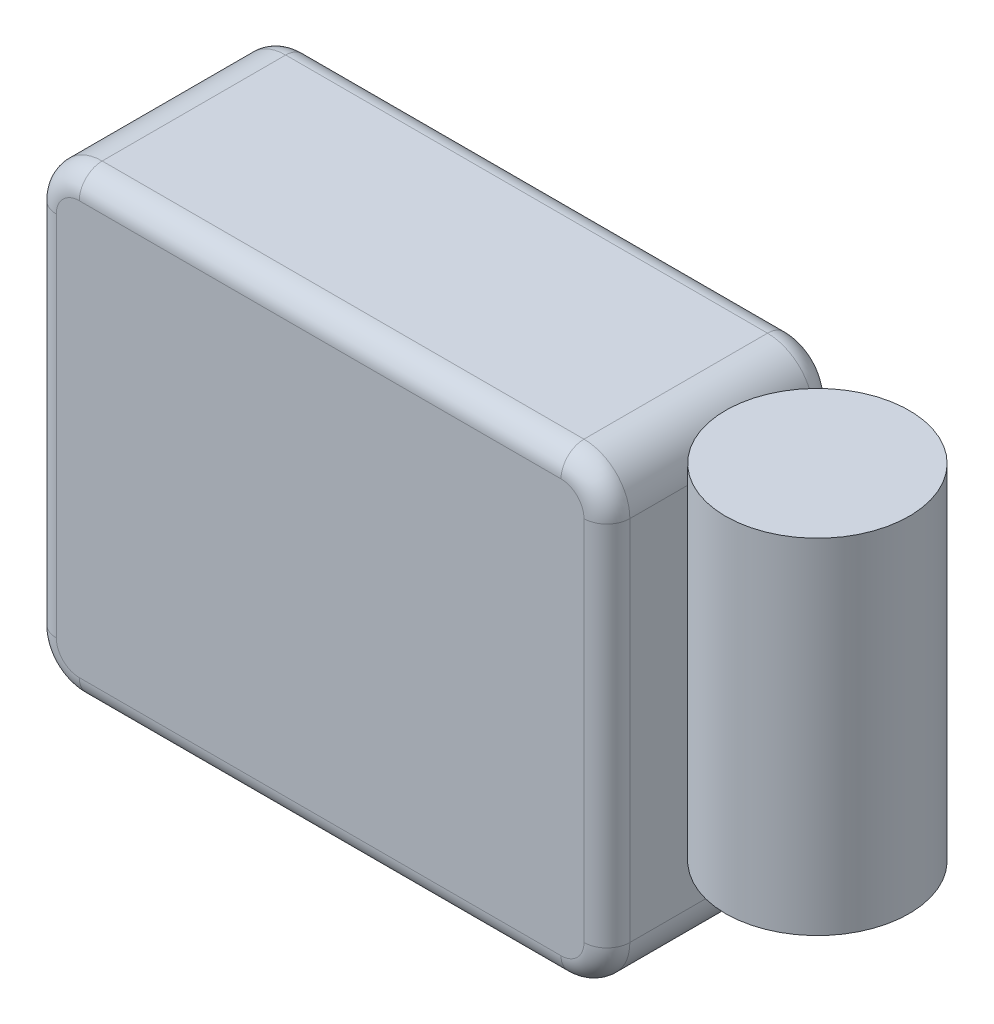
ISO-10303-21;
HEADER;
FILE_DESCRIPTION(('STEP AP214'),'2;1');
FILE_NAME('part.step','',(''),(''),'','','');
FILE_SCHEMA(('AUTOMOTIVE_DESIGN { 1 0 10303 214 1 1 1 1 }'));
ENDSEC;
DATA;
#1=APPLICATION_CONTEXT('core data for automotive mechanical design processes');
#2=APPLICATION_PROTOCOL_DEFINITION('international standard','automotive_design',2000,#1);
#3=PRODUCT_CONTEXT('',#1,'mechanical');
#4=PRODUCT('Part','Part','',(#3));
#5=PRODUCT_RELATED_PRODUCT_CATEGORY('part','',(#4));
#6=PRODUCT_DEFINITION_FORMATION('','',#4);
#7=PRODUCT_DEFINITION_CONTEXT('part definition',#1,'design');
#8=PRODUCT_DEFINITION('design','',#6,#7);
#9=PRODUCT_DEFINITION_SHAPE('','',#8);
#10=(LENGTH_UNIT() NAMED_UNIT(*) SI_UNIT(.MILLI.,.METRE.));
#11=(NAMED_UNIT(*) PLANE_ANGLE_UNIT() SI_UNIT($,.RADIAN.));
#12=(NAMED_UNIT(*) SI_UNIT($,.STERADIAN.) SOLID_ANGLE_UNIT());
#13=UNCERTAINTY_MEASURE_WITH_UNIT(LENGTH_MEASURE(1.E-05),#10,'distance_accuracy_value','');
#14=(GEOMETRIC_REPRESENTATION_CONTEXT(3) GLOBAL_UNCERTAINTY_ASSIGNED_CONTEXT((#13)) GLOBAL_UNIT_ASSIGNED_CONTEXT((#10,
#11,#12)) REPRESENTATION_CONTEXT('',''));
#15=CARTESIAN_POINT('',(0.,0.,0.));
#16=DIRECTION('',(0.,0.,1.));
#17=DIRECTION('',(1.,0.,0.));
#18=AXIS2_PLACEMENT_3D('',#15,#16,#17);
#19=CARTESIAN_POINT('',(155.148869638961,8.05710113009715,4.82615975000589));
#20=DIRECTION('',(0.,1.,0.));
#21=DIRECTION('',(0.,0.,1.));
#22=AXIS2_PLACEMENT_3D('',#19,#20,#21);
#23=CYLINDRICAL_SURFACE('',#22,3.99999999999999);
#24=CARTESIAN_POINT('',(155.148869638961,8.05710113009715,4.82615975000589));
#25=DIRECTION('',(0.,1.,0.));
#26=DIRECTION('',(0.,0.,1.));
#27=AXIS2_PLACEMENT_3D('',#24,#25,#26);
#28=CIRCLE('',#27,3.99999999999999);
#29=CARTESIAN_POINT('',(155.148869638961,8.05710113009715,8.82615975000588));
#30=VERTEX_POINT('',#29);
#31=EDGE_CURVE('E11',#30,#30,#28,.T.);
#32=ORIENTED_EDGE('',*,*,#31,.T.);
#33=EDGE_LOOP('',(#32));
#34=FACE_BOUND('',#33,.T.);
#35=CARTESIAN_POINT('',(155.148869638961,23.0571011300972,4.82615975000589));
#36=DIRECTION('',(0.,1.,0.));
#37=DIRECTION('',(0.,0.,1.));
#38=AXIS2_PLACEMENT_3D('',#35,#36,#37);
#39=CIRCLE('',#38,3.99999999999999);
#40=CARTESIAN_POINT('',(155.148869638961,23.0571011300972,8.82615975000588));
#41=VERTEX_POINT('',#40);
#42=EDGE_CURVE('E46',#41,#41,#39,.T.);
#43=ORIENTED_EDGE('',*,*,#42,.F.);
#44=EDGE_LOOP('',(#43));
#45=FACE_BOUND('',#44,.T.);
#46=ADVANCED_FACE('F43',(#34,#45),#23,.T.);
#47=CARTESIAN_POINT('',(155.148869638961,8.05710113009715,4.82615975000589));
#48=DIRECTION('',(0.,1.,0.));
#49=DIRECTION('',(0.,0.,1.));
#50=AXIS2_PLACEMENT_3D('',#47,#48,#49);
#51=PLANE('',#50);
#52=ORIENTED_EDGE('',*,*,#31,.F.);
#53=EDGE_LOOP('',(#52));
#54=FACE_BOUND('',#53,.T.);
#55=ADVANCED_FACE('F58',(#54),#51,.F.);
#56=CARTESIAN_POINT('',(155.148869638961,23.0571011300972,4.82615975000589));
#57=DIRECTION('',(0.,1.,0.));
#58=DIRECTION('',(0.,0.,1.));
#59=AXIS2_PLACEMENT_3D('',#56,#57,#58);
#60=PLANE('',#59);
#61=ORIENTED_EDGE('',*,*,#42,.T.);
#62=EDGE_LOOP('',(#61));
#63=FACE_BOUND('',#62,.T.);
#64=ADVANCED_FACE('F55',(#63),#60,.T.);
#65=CLOSED_SHELL('',(#46,#55,#64));
#66=MANIFOLD_SOLID_BREP('B2',#65);
#67=CARTESIAN_POINT('',(126.148869638961,23.0571011300972,10.));
#68=DIRECTION('',(1.,0.,0.));
#69=DIRECTION('',(0.,0.,-1.));
#70=AXIS2_PLACEMENT_3D('',#67,#68,#69);
#71=PLANE('',#70);
#72=DIRECTION('',(0.,0.,-1.));
#73=VECTOR('',#72,1.);
#74=CARTESIAN_POINT('',(126.148869638961,21.0571011300971,10.));
#75=LINE('',#74,#73);
#76=CARTESIAN_POINT('',(126.148869638961,21.0571011300971,9.));
#77=VERTEX_POINT('',#76);
#78=CARTESIAN_POINT('',(126.148869638961,21.0571011300971,0.999999999999999));
#79=VERTEX_POINT('',#78);
#80=EDGE_CURVE('E331',#77,#79,#75,.T.);
#81=ORIENTED_EDGE('',*,*,#80,.T.);
#82=DIRECTION('',(0.,-1.,0.));
#83=VECTOR('',#82,1.);
#84=CARTESIAN_POINT('',(126.148869638961,23.0571011300972,0.999999999999999));
#85=LINE('',#84,#83);
#86=CARTESIAN_POINT('',(126.148869638961,5.05710113009715,0.999999999999999));
#87=VERTEX_POINT('',#86);
#88=EDGE_CURVE('E258',#79,#87,#85,.T.);
#89=ORIENTED_EDGE('',*,*,#88,.T.);
#90=DIRECTION('',(0.,0.,-1.));
#91=VECTOR('',#90,1.);
#92=CARTESIAN_POINT('',(126.148869638961,5.05710113009715,10.));
#93=LINE('',#92,#91);
#94=CARTESIAN_POINT('',(126.148869638961,5.05710113009715,9.));
#95=VERTEX_POINT('',#94);
#96=EDGE_CURVE('E289',#87,#95,#93,.F.);
#97=ORIENTED_EDGE('',*,*,#96,.T.);
#98=DIRECTION('',(0.,-1.,0.));
#99=VECTOR('',#98,1.);
#100=CARTESIAN_POINT('',(126.148869638961,21.0571011300971,9.));
#101=LINE('',#100,#99);
#102=EDGE_CURVE('E256',#95,#77,#101,.F.);
#103=ORIENTED_EDGE('',*,*,#102,.T.);
#104=EDGE_LOOP('',(#81,#89,#97,#103));
#105=FACE_BOUND('',#104,.T.);
#106=ADVANCED_FACE('F84',(#105),#71,.F.);
#107=CARTESIAN_POINT('',(126.148869638961,3.05710113009715,10.));
#108=DIRECTION('',(0.,1.,0.));
#109=DIRECTION('',(0.,0.,1.));
#110=AXIS2_PLACEMENT_3D('',#107,#108,#109);
#111=PLANE('',#110);
#112=DIRECTION('',(0.,0.,-1.));
#113=VECTOR('',#112,1.);
#114=CARTESIAN_POINT('',(128.148869638961,3.05710113009715,10.));
#115=LINE('',#114,#113);
#116=CARTESIAN_POINT('',(128.148869638961,3.05710113009715,9.));
#117=VERTEX_POINT('',#116);
#118=CARTESIAN_POINT('',(128.148869638961,3.05710113009715,0.999999999999999));
#119=VERTEX_POINT('',#118);
#120=EDGE_CURVE('E327',#117,#119,#115,.T.);
#121=ORIENTED_EDGE('',*,*,#120,.T.);
#122=DIRECTION('',(1.,0.,0.));
#123=VECTOR('',#122,1.);
#124=CARTESIAN_POINT('',(126.148869638961,3.05710113009715,0.999999999999999));
#125=LINE('',#124,#123);
#126=CARTESIAN_POINT('',(149.148869638961,3.05710113009715,0.999999999999999));
#127=VERTEX_POINT('',#126);
#128=EDGE_CURVE('E233',#119,#127,#125,.T.);
#129=ORIENTED_EDGE('',*,*,#128,.T.);
#130=DIRECTION('',(0.,0.,-1.));
#131=VECTOR('',#130,1.);
#132=CARTESIAN_POINT('',(149.148869638961,3.05710113009715,10.));
#133=LINE('',#132,#131);
#134=CARTESIAN_POINT('',(149.148869638961,3.05710113009715,9.));
#135=VERTEX_POINT('',#134);
#136=EDGE_CURVE('E217',#127,#135,#133,.F.);
#137=ORIENTED_EDGE('',*,*,#136,.T.);
#138=DIRECTION('',(1.,0.,0.));
#139=VECTOR('',#138,1.);
#140=CARTESIAN_POINT('',(128.148869638961,3.05710113009715,9.));
#141=LINE('',#140,#139);
#142=EDGE_CURVE('E231',#135,#117,#141,.F.);
#143=ORIENTED_EDGE('',*,*,#142,.T.);
#144=EDGE_LOOP('',(#121,#129,#137,#143));
#145=FACE_BOUND('',#144,.T.);
#146=ADVANCED_FACE('F368',(#145),#111,.F.);
#147=CARTESIAN_POINT('',(151.148869638961,23.0571011300972,10.));
#148=DIRECTION('',(-1.,0.,0.));
#149=DIRECTION('',(0.,0.,1.));
#150=AXIS2_PLACEMENT_3D('',#147,#148,#149);
#151=PLANE('',#150);
#152=DIRECTION('',(0.,0.,-1.));
#153=VECTOR('',#152,1.);
#154=CARTESIAN_POINT('',(151.148869638961,5.05710113009715,10.));
#155=LINE('',#154,#153);
#156=CARTESIAN_POINT('',(151.148869638961,5.05710113009715,9.));
#157=VERTEX_POINT('',#156);
#158=CARTESIAN_POINT('',(151.148869638961,5.05710113009715,0.999999999999999));
#159=VERTEX_POINT('',#158);
#160=EDGE_CURVE('E341',#157,#159,#155,.T.);
#161=ORIENTED_EDGE('',*,*,#160,.T.);
#162=DIRECTION('',(0.,1.,0.));
#163=VECTOR('',#162,1.);
#164=CARTESIAN_POINT('',(151.148869638961,23.0571011300972,0.999999999999999));
#165=LINE('',#164,#163);
#166=CARTESIAN_POINT('',(151.148869638961,21.0571011300971,0.999999999999999));
#167=VERTEX_POINT('',#166);
#168=EDGE_CURVE('E241',#159,#167,#165,.T.);
#169=ORIENTED_EDGE('',*,*,#168,.T.);
#170=DIRECTION('',(0.,0.,-1.));
#171=VECTOR('',#170,1.);
#172=CARTESIAN_POINT('',(151.148869638961,21.0571011300971,10.));
#173=LINE('',#172,#171);
#174=CARTESIAN_POINT('',(151.148869638961,21.0571011300971,9.));
#175=VERTEX_POINT('',#174);
#176=EDGE_CURVE('E344',#167,#175,#173,.F.);
#177=ORIENTED_EDGE('',*,*,#176,.T.);
#178=DIRECTION('',(0.,1.,0.));
#179=VECTOR('',#178,1.);
#180=CARTESIAN_POINT('',(151.148869638961,5.05710113009715,9.));
#181=LINE('',#180,#179);
#182=EDGE_CURVE('E239',#175,#157,#181,.F.);
#183=ORIENTED_EDGE('',*,*,#182,.T.);
#184=EDGE_LOOP('',(#161,#169,#177,#183));
#185=FACE_BOUND('',#184,.T.);
#186=ADVANCED_FACE('F412',(#185),#151,.F.);
#187=CARTESIAN_POINT('',(126.148869638961,23.0571011300972,10.));
#188=DIRECTION('',(0.,-1.,0.));
#189=DIRECTION('',(0.,0.,-1.));
#190=AXIS2_PLACEMENT_3D('',#187,#188,#189);
#191=PLANE('',#190);
#192=DIRECTION('',(0.,0.,-1.));
#193=VECTOR('',#192,1.);
#194=CARTESIAN_POINT('',(149.148869638961,23.0571011300972,10.));
#195=LINE('',#194,#193);
#196=CARTESIAN_POINT('',(149.148869638961,23.0571011300972,9.));
#197=VERTEX_POINT('',#196);
#198=CARTESIAN_POINT('',(149.148869638961,23.0571011300972,0.999999999999999));
#199=VERTEX_POINT('',#198);
#200=EDGE_CURVE('E333',#197,#199,#195,.T.);
#201=ORIENTED_EDGE('',*,*,#200,.T.);
#202=DIRECTION('',(-1.,0.,0.));
#203=VECTOR('',#202,1.);
#204=CARTESIAN_POINT('',(126.148869638961,23.0571011300972,0.999999999999999));
#205=LINE('',#204,#203);
#206=CARTESIAN_POINT('',(128.148869638961,23.0571011300972,0.999999999999999));
#207=VERTEX_POINT('',#206);
#208=EDGE_CURVE('E250',#199,#207,#205,.T.);
#209=ORIENTED_EDGE('',*,*,#208,.T.);
#210=DIRECTION('',(0.,0.,-1.));
#211=VECTOR('',#210,1.);
#212=CARTESIAN_POINT('',(128.148869638961,23.0571011300972,10.));
#213=LINE('',#212,#211);
#214=CARTESIAN_POINT('',(128.148869638961,23.0571011300972,9.));
#215=VERTEX_POINT('',#214);
#216=EDGE_CURVE('E338',#207,#215,#213,.F.);
#217=ORIENTED_EDGE('',*,*,#216,.T.);
#218=DIRECTION('',(-1.,0.,0.));
#219=VECTOR('',#218,1.);
#220=CARTESIAN_POINT('',(149.148869638961,23.0571011300972,9.));
#221=LINE('',#220,#219);
#222=EDGE_CURVE('E248',#215,#197,#221,.F.);
#223=ORIENTED_EDGE('',*,*,#222,.T.);
#224=EDGE_LOOP('',(#201,#209,#217,#223));
#225=FACE_BOUND('',#224,.T.);
#226=ADVANCED_FACE('F396',(#225),#191,.F.);
#227=CARTESIAN_POINT('',(0.,0.,10.));
#228=DIRECTION('',(0.,0.,1.));
#229=DIRECTION('',(1.,0.,0.));
#230=AXIS2_PLACEMENT_3D('',#227,#228,#229);
#231=PLANE('',#230);
#232=DIRECTION('',(0.,1.,0.));
#233=VECTOR('',#232,1.);
#234=CARTESIAN_POINT('',(150.148869638961,21.0571011300971,10.));
#235=LINE('',#234,#233);
#236=CARTESIAN_POINT('',(150.148869638961,5.05710113009715,10.));
#237=VERTEX_POINT('',#236);
#238=CARTESIAN_POINT('',(150.148869638961,21.0571011300971,10.));
#239=VERTEX_POINT('',#238);
#240=EDGE_CURVE('E93',#237,#239,#235,.T.);
#241=ORIENTED_EDGE('',*,*,#240,.T.);
#242=CARTESIAN_POINT('',(149.148869638961,21.0571011300971,10.));
#243=DIRECTION('',(0.,0.,1.));
#244=DIRECTION('',(1.,0.,0.));
#245=AXIS2_PLACEMENT_3D('',#242,#243,#244);
#246=CIRCLE('',#245,1.);
#247=CARTESIAN_POINT('',(149.148869638961,22.0571011300972,10.));
#248=VERTEX_POINT('',#247);
#249=EDGE_CURVE('E41',#239,#248,#246,.T.);
#250=ORIENTED_EDGE('',*,*,#249,.T.);
#251=DIRECTION('',(-1.,0.,0.));
#252=VECTOR('',#251,1.);
#253=CARTESIAN_POINT('',(128.148869638961,22.0571011300972,10.));
#254=LINE('',#253,#252);
#255=CARTESIAN_POINT('',(128.148869638961,22.0571011300972,10.));
#256=VERTEX_POINT('',#255);
#257=EDGE_CURVE('E260',#248,#256,#254,.T.);
#258=ORIENTED_EDGE('',*,*,#257,.T.);
#259=CARTESIAN_POINT('',(128.148869638961,21.0571011300971,10.));
#260=DIRECTION('',(0.,0.,1.));
#261=DIRECTION('',(1.,0.,0.));
#262=AXIS2_PLACEMENT_3D('',#259,#260,#261);
#263=CIRCLE('',#262,1.);
#264=CARTESIAN_POINT('',(127.148869638961,21.0571011300971,10.));
#265=VERTEX_POINT('',#264);
#266=EDGE_CURVE('E262',#256,#265,#263,.T.);
#267=ORIENTED_EDGE('',*,*,#266,.T.);
#268=DIRECTION('',(0.,-1.,0.));
#269=VECTOR('',#268,1.);
#270=CARTESIAN_POINT('',(127.148869638961,5.05710113009715,10.));
#271=LINE('',#270,#269);
#272=CARTESIAN_POINT('',(127.148869638961,5.05710113009715,10.));
#273=VERTEX_POINT('',#272);
#274=EDGE_CURVE('E264',#265,#273,#271,.T.);
#275=ORIENTED_EDGE('',*,*,#274,.T.);
#276=CARTESIAN_POINT('',(128.148869638961,5.05710113009715,10.));
#277=DIRECTION('',(0.,0.,1.));
#278=DIRECTION('',(1.,0.,0.));
#279=AXIS2_PLACEMENT_3D('',#276,#277,#278);
#280=CIRCLE('',#279,1.);
#281=CARTESIAN_POINT('',(128.148869638961,4.05710113009715,10.));
#282=VERTEX_POINT('',#281);
#283=EDGE_CURVE('E266',#273,#282,#280,.T.);
#284=ORIENTED_EDGE('',*,*,#283,.T.);
#285=DIRECTION('',(1.,0.,0.));
#286=VECTOR('',#285,1.);
#287=CARTESIAN_POINT('',(149.148869638961,4.05710113009715,10.));
#288=LINE('',#287,#286);
#289=CARTESIAN_POINT('',(149.148869638961,4.05710113009715,10.));
#290=VERTEX_POINT('',#289);
#291=EDGE_CURVE('E268',#282,#290,#288,.T.);
#292=ORIENTED_EDGE('',*,*,#291,.T.);
#293=CARTESIAN_POINT('',(149.148869638961,5.05710113009715,10.));
#294=DIRECTION('',(0.,0.,1.));
#295=DIRECTION('',(1.,0.,0.));
#296=AXIS2_PLACEMENT_3D('',#293,#294,#295);
#297=CIRCLE('',#296,1.);
#298=EDGE_CURVE('E104',#290,#237,#297,.T.);
#299=ORIENTED_EDGE('',*,*,#298,.T.);
#300=EDGE_LOOP('',(#241,#250,#258,#267,#275,#284,#292,#299));
#301=FACE_BOUND('',#300,.T.);
#302=ADVANCED_FACE('F384',(#301),#231,.T.);
#303=CARTESIAN_POINT('',(0.,0.,0.));
#304=DIRECTION('',(0.,0.,1.));
#305=DIRECTION('',(1.,0.,0.));
#306=AXIS2_PLACEMENT_3D('',#303,#304,#305);
#307=PLANE('',#306);
#308=DIRECTION('',(1.,0.,0.));
#309=VECTOR('',#308,1.);
#310=CARTESIAN_POINT('',(0.,4.05710113009715,0.));
#311=LINE('',#310,#309);
#312=CARTESIAN_POINT('',(149.148869638961,4.05710113009715,0.));
#313=VERTEX_POINT('',#312);
#314=CARTESIAN_POINT('',(128.148869638961,4.05710113009715,0.));
#315=VERTEX_POINT('',#314);
#316=EDGE_CURVE('E221',#313,#315,#311,.F.);
#317=ORIENTED_EDGE('',*,*,#316,.T.);
#318=CARTESIAN_POINT('',(128.148869638961,5.05710113009715,0.));
#319=DIRECTION('',(0.,0.,1.));
#320=DIRECTION('',(1.,0.,0.));
#321=AXIS2_PLACEMENT_3D('',#318,#319,#320);
#322=CIRCLE('',#321,1.);
#323=CARTESIAN_POINT('',(127.148869638961,5.05710113009715,0.));
#324=VERTEX_POINT('',#323);
#325=EDGE_CURVE('E202',#315,#324,#322,.F.);
#326=ORIENTED_EDGE('',*,*,#325,.T.);
#327=DIRECTION('',(0.,-1.,0.));
#328=VECTOR('',#327,1.);
#329=CARTESIAN_POINT('',(127.148869638961,0.,0.));
#330=LINE('',#329,#328);
#331=CARTESIAN_POINT('',(127.148869638961,21.0571011300971,0.));
#332=VERTEX_POINT('',#331);
#333=EDGE_CURVE('E210',#324,#332,#330,.F.);
#334=ORIENTED_EDGE('',*,*,#333,.T.);
#335=CARTESIAN_POINT('',(128.148869638961,21.0571011300971,0.));
#336=DIRECTION('',(0.,0.,1.));
#337=DIRECTION('',(1.,0.,0.));
#338=AXIS2_PLACEMENT_3D('',#335,#336,#337);
#339=CIRCLE('',#338,1.);
#340=CARTESIAN_POINT('',(128.148869638961,22.0571011300972,0.));
#341=VERTEX_POINT('',#340);
#342=EDGE_CURVE('E216',#332,#341,#339,.F.);
#343=ORIENTED_EDGE('',*,*,#342,.T.);
#344=DIRECTION('',(-1.,0.,0.));
#345=VECTOR('',#344,1.);
#346=CARTESIAN_POINT('',(0.,22.0571011300972,0.));
#347=LINE('',#346,#345);
#348=CARTESIAN_POINT('',(149.148869638961,22.0571011300972,0.));
#349=VERTEX_POINT('',#348);
#350=EDGE_CURVE('E351',#341,#349,#347,.F.);
#351=ORIENTED_EDGE('',*,*,#350,.T.);
#352=CARTESIAN_POINT('',(149.148869638961,21.0571011300971,0.));
#353=DIRECTION('',(0.,0.,1.));
#354=DIRECTION('',(1.,0.,0.));
#355=AXIS2_PLACEMENT_3D('',#352,#353,#354);
#356=CIRCLE('',#355,1.);
#357=CARTESIAN_POINT('',(150.148869638961,21.0571011300971,0.));
#358=VERTEX_POINT('',#357);
#359=EDGE_CURVE('E353',#349,#358,#356,.F.);
#360=ORIENTED_EDGE('',*,*,#359,.T.);
#361=DIRECTION('',(0.,1.,0.));
#362=VECTOR('',#361,1.);
#363=CARTESIAN_POINT('',(150.148869638961,0.,0.));
#364=LINE('',#363,#362);
#365=CARTESIAN_POINT('',(150.148869638961,5.05710113009715,0.));
#366=VERTEX_POINT('',#365);
#367=EDGE_CURVE('E355',#358,#366,#364,.F.);
#368=ORIENTED_EDGE('',*,*,#367,.T.);
#369=CARTESIAN_POINT('',(149.148869638961,5.05710113009715,0.));
#370=DIRECTION('',(0.,0.,1.));
#371=DIRECTION('',(1.,0.,0.));
#372=AXIS2_PLACEMENT_3D('',#369,#370,#371);
#373=CIRCLE('',#372,1.);
#374=EDGE_CURVE('E226',#366,#313,#373,.F.);
#375=ORIENTED_EDGE('',*,*,#374,.T.);
#376=EDGE_LOOP('',(#317,#326,#334,#343,#351,#360,#368,#375));
#377=FACE_BOUND('',#376,.T.);
#378=ADVANCED_FACE('F219',(#377),#307,.F.);
#379=CARTESIAN_POINT('',(128.148869638961,21.0571011300971,10.));
#380=DIRECTION('',(0.,0.,-1.));
#381=DIRECTION('',(-1.,0.,0.));
#382=AXIS2_PLACEMENT_3D('',#379,#380,#381);
#383=CYLINDRICAL_SURFACE('',#382,2.);
#384=ORIENTED_EDGE('',*,*,#216,.F.);
#385=CARTESIAN_POINT('',(128.148869638961,21.0571011300971,0.999999999999999));
#386=DIRECTION('',(0.,0.,1.));
#387=DIRECTION('',(1.,0.,0.));
#388=AXIS2_PLACEMENT_3D('',#385,#386,#387);
#389=CIRCLE('',#388,2.);
#390=EDGE_CURVE('E254',#207,#79,#389,.T.);
#391=ORIENTED_EDGE('',*,*,#390,.T.);
#392=ORIENTED_EDGE('',*,*,#80,.F.);
#393=CARTESIAN_POINT('',(128.148869638961,21.0571011300971,9.));
#394=DIRECTION('',(0.,0.,1.));
#395=DIRECTION('',(1.,0.,0.));
#396=AXIS2_PLACEMENT_3D('',#393,#394,#395);
#397=CIRCLE('',#396,2.);
#398=EDGE_CURVE('E252',#77,#215,#397,.F.);
#399=ORIENTED_EDGE('',*,*,#398,.T.);
#400=EDGE_LOOP('',(#384,#391,#392,#399));
#401=FACE_BOUND('',#400,.T.);
#402=ADVANCED_FACE('F426',(#401),#383,.T.);
#403=CARTESIAN_POINT('',(149.148869638961,21.0571011300971,10.));
#404=DIRECTION('',(0.,0.,-1.));
#405=DIRECTION('',(-1.,0.,0.));
#406=AXIS2_PLACEMENT_3D('',#403,#404,#405);
#407=CYLINDRICAL_SURFACE('',#406,2.);
#408=ORIENTED_EDGE('',*,*,#176,.F.);
#409=CARTESIAN_POINT('',(149.148869638961,21.0571011300971,0.999999999999999));
#410=DIRECTION('',(0.,0.,1.));
#411=DIRECTION('',(1.,0.,0.));
#412=AXIS2_PLACEMENT_3D('',#409,#410,#411);
#413=CIRCLE('',#412,2.);
#414=EDGE_CURVE('E246',#167,#199,#413,.T.);
#415=ORIENTED_EDGE('',*,*,#414,.T.);
#416=ORIENTED_EDGE('',*,*,#200,.F.);
#417=CARTESIAN_POINT('',(149.148869638961,21.0571011300971,9.));
#418=DIRECTION('',(0.,0.,1.));
#419=DIRECTION('',(1.,0.,0.));
#420=AXIS2_PLACEMENT_3D('',#417,#418,#419);
#421=CIRCLE('',#420,2.);
#422=EDGE_CURVE('E243',#197,#175,#421,.F.);
#423=ORIENTED_EDGE('',*,*,#422,.T.);
#424=EDGE_LOOP('',(#408,#415,#416,#423));
#425=FACE_BOUND('',#424,.T.);
#426=ADVANCED_FACE('F401',(#425),#407,.T.);
#427=CARTESIAN_POINT('',(149.148869638961,5.05710113009715,10.));
#428=DIRECTION('',(0.,0.,-1.));
#429=DIRECTION('',(-1.,0.,0.));
#430=AXIS2_PLACEMENT_3D('',#427,#428,#429);
#431=CYLINDRICAL_SURFACE('',#430,2.);
#432=ORIENTED_EDGE('',*,*,#136,.F.);
#433=CARTESIAN_POINT('',(149.148869638961,5.05710113009715,0.999999999999999));
#434=DIRECTION('',(0.,0.,1.));
#435=DIRECTION('',(1.,0.,0.));
#436=AXIS2_PLACEMENT_3D('',#433,#434,#435);
#437=CIRCLE('',#436,2.);
#438=EDGE_CURVE('E237',#127,#159,#437,.T.);
#439=ORIENTED_EDGE('',*,*,#438,.T.);
#440=ORIENTED_EDGE('',*,*,#160,.F.);
#441=CARTESIAN_POINT('',(149.148869638961,5.05710113009715,9.));
#442=DIRECTION('',(0.,0.,1.));
#443=DIRECTION('',(1.,0.,0.));
#444=AXIS2_PLACEMENT_3D('',#441,#442,#443);
#445=CIRCLE('',#444,2.);
#446=EDGE_CURVE('E235',#157,#135,#445,.F.);
#447=ORIENTED_EDGE('',*,*,#446,.T.);
#448=EDGE_LOOP('',(#432,#439,#440,#447));
#449=FACE_BOUND('',#448,.T.);
#450=ADVANCED_FACE('F370',(#449),#431,.T.);
#451=CARTESIAN_POINT('',(128.148869638961,5.05710113009715,10.));
#452=DIRECTION('',(0.,0.,-1.));
#453=DIRECTION('',(-1.,0.,0.));
#454=AXIS2_PLACEMENT_3D('',#451,#452,#453);
#455=CYLINDRICAL_SURFACE('',#454,2.);
#456=ORIENTED_EDGE('',*,*,#96,.F.);
#457=CARTESIAN_POINT('',(128.148869638961,5.05710113009715,0.999999999999999));
#458=DIRECTION('',(0.,0.,1.));
#459=DIRECTION('',(1.,0.,0.));
#460=AXIS2_PLACEMENT_3D('',#457,#458,#459);
#461=CIRCLE('',#460,2.);
#462=EDGE_CURVE('E204',#87,#119,#461,.T.);
#463=ORIENTED_EDGE('',*,*,#462,.T.);
#464=ORIENTED_EDGE('',*,*,#120,.F.);
#465=CARTESIAN_POINT('',(128.148869638961,5.05710113009715,9.));
#466=DIRECTION('',(0.,0.,1.));
#467=DIRECTION('',(1.,0.,0.));
#468=AXIS2_PLACEMENT_3D('',#465,#466,#467);
#469=CIRCLE('',#468,2.);
#470=EDGE_CURVE('E223',#117,#95,#469,.F.);
#471=ORIENTED_EDGE('',*,*,#470,.T.);
#472=EDGE_LOOP('',(#456,#463,#464,#471));
#473=FACE_BOUND('',#472,.T.);
#474=ADVANCED_FACE('F325',(#473),#455,.T.);
#475=CARTESIAN_POINT('',(149.148869638961,21.0571011300971,0.999999999999999));
#476=DIRECTION('',(0.,0.,1.));
#477=DIRECTION('',(1.,0.,0.));
#478=AXIS2_PLACEMENT_3D('',#475,#476,#477);
#479=DEGENERATE_TOROIDAL_SURFACE('',#478,1.,1.,.T.);
#480=CARTESIAN_POINT('',(149.148869638961,22.0571011300972,0.999999999999999));
#481=DIRECTION('',(-1.,0.,0.));
#482=DIRECTION('',(0.,0.,1.));
#483=AXIS2_PLACEMENT_3D('',#480,#481,#482);
#484=CIRCLE('',#483,1.);
#485=EDGE_CURVE('E283',#199,#349,#484,.T.);
#486=ORIENTED_EDGE('',*,*,#485,.F.);
#487=ORIENTED_EDGE('',*,*,#414,.F.);
#488=CARTESIAN_POINT('',(150.148869638961,21.0571011300971,1.));
#489=DIRECTION('',(0.,-1.,0.));
#490=DIRECTION('',(0.,0.,-1.));
#491=AXIS2_PLACEMENT_3D('',#488,#489,#490);
#492=CIRCLE('',#491,1.);
#493=EDGE_CURVE('E286',#358,#167,#492,.T.);
#494=ORIENTED_EDGE('',*,*,#493,.F.);
#495=ORIENTED_EDGE('',*,*,#359,.F.);
#496=EDGE_LOOP('',(#486,#487,#494,#495));
#497=FACE_BOUND('',#496,.T.);
#498=ADVANCED_FACE('F405',(#497),#479,.T.);
#499=CARTESIAN_POINT('',(150.148869638961,23.0571011300972,0.999999999999999));
#500=DIRECTION('',(0.,1.,0.));
#501=DIRECTION('',(0.,0.,1.));
#502=AXIS2_PLACEMENT_3D('',#499,#500,#501);
#503=CYLINDRICAL_SURFACE('',#502,1.);
#504=ORIENTED_EDGE('',*,*,#493,.T.);
#505=ORIENTED_EDGE('',*,*,#168,.F.);
#506=CARTESIAN_POINT('',(150.148869638961,5.05710113009715,1.));
#507=DIRECTION('',(0.,-1.,0.));
#508=DIRECTION('',(0.,0.,-1.));
#509=AXIS2_PLACEMENT_3D('',#506,#507,#508);
#510=CIRCLE('',#509,1.);
#511=EDGE_CURVE('E280',#366,#159,#510,.T.);
#512=ORIENTED_EDGE('',*,*,#511,.F.);
#513=ORIENTED_EDGE('',*,*,#367,.F.);
#514=EDGE_LOOP('',(#504,#505,#512,#513));
#515=FACE_BOUND('',#514,.T.);
#516=ADVANCED_FACE('F410',(#515),#503,.T.);
#517=CARTESIAN_POINT('',(126.148869638961,22.0571011300972,0.999999999999999));
#518=DIRECTION('',(-1.,0.,0.));
#519=DIRECTION('',(0.,0.,1.));
#520=AXIS2_PLACEMENT_3D('',#517,#518,#519);
#521=CYLINDRICAL_SURFACE('',#520,1.);
#522=ORIENTED_EDGE('',*,*,#485,.T.);
#523=ORIENTED_EDGE('',*,*,#350,.F.);
#524=CARTESIAN_POINT('',(128.148869638961,22.0571011300972,0.999999999999999));
#525=DIRECTION('',(-1.,0.,0.));
#526=DIRECTION('',(0.,0.,1.));
#527=AXIS2_PLACEMENT_3D('',#524,#525,#526);
#528=CIRCLE('',#527,1.);
#529=EDGE_CURVE('E277',#207,#341,#528,.T.);
#530=ORIENTED_EDGE('',*,*,#529,.F.);
#531=ORIENTED_EDGE('',*,*,#208,.F.);
#532=EDGE_LOOP('',(#522,#523,#530,#531));
#533=FACE_BOUND('',#532,.T.);
#534=ADVANCED_FACE('F448',(#533),#521,.T.);
#535=CARTESIAN_POINT('',(149.148869638961,5.05710113009715,0.999999999999999));
#536=DIRECTION('',(0.,0.,1.));
#537=DIRECTION('',(1.,0.,0.));
#538=AXIS2_PLACEMENT_3D('',#535,#536,#537);
#539=DEGENERATE_TOROIDAL_SURFACE('',#538,1.,1.,.T.);
#540=ORIENTED_EDGE('',*,*,#511,.T.);
#541=ORIENTED_EDGE('',*,*,#438,.F.);
#542=CARTESIAN_POINT('',(149.148869638961,4.05710113009715,1.));
#543=DIRECTION('',(-1.,0.,0.));
#544=DIRECTION('',(0.,0.,1.));
#545=AXIS2_PLACEMENT_3D('',#542,#543,#544);
#546=CIRCLE('',#545,1.);
#547=EDGE_CURVE('E274',#313,#127,#546,.T.);
#548=ORIENTED_EDGE('',*,*,#547,.F.);
#549=ORIENTED_EDGE('',*,*,#374,.F.);
#550=EDGE_LOOP('',(#540,#541,#548,#549));
#551=FACE_BOUND('',#550,.T.);
#552=ADVANCED_FACE('F362',(#551),#539,.T.);
#553=CARTESIAN_POINT('',(128.148869638961,21.0571011300971,0.999999999999999));
#554=DIRECTION('',(0.,0.,1.));
#555=DIRECTION('',(1.,0.,0.));
#556=AXIS2_PLACEMENT_3D('',#553,#554,#555);
#557=DEGENERATE_TOROIDAL_SURFACE('',#556,1.,1.,.T.);
#558=ORIENTED_EDGE('',*,*,#529,.T.);
#559=ORIENTED_EDGE('',*,*,#342,.F.);
#560=CARTESIAN_POINT('',(127.148869638961,21.0571011300971,0.999999999999999));
#561=DIRECTION('',(0.,-1.,0.));
#562=DIRECTION('',(0.,0.,-1.));
#563=AXIS2_PLACEMENT_3D('',#560,#561,#562);
#564=CIRCLE('',#563,1.);
#565=EDGE_CURVE('E213',#79,#332,#564,.T.);
#566=ORIENTED_EDGE('',*,*,#565,.F.);
#567=ORIENTED_EDGE('',*,*,#390,.F.);
#568=EDGE_LOOP('',(#558,#559,#566,#567));
#569=FACE_BOUND('',#568,.T.);
#570=ADVANCED_FACE('F442',(#569),#557,.T.);
#571=CARTESIAN_POINT('',(126.148869638961,4.05710113009715,0.999999999999999));
#572=DIRECTION('',(1.,0.,0.));
#573=DIRECTION('',(0.,0.,-1.));
#574=AXIS2_PLACEMENT_3D('',#571,#572,#573);
#575=CYLINDRICAL_SURFACE('',#574,1.);
#576=ORIENTED_EDGE('',*,*,#547,.T.);
#577=ORIENTED_EDGE('',*,*,#128,.F.);
#578=CARTESIAN_POINT('',(128.148869638961,4.05710113009715,1.));
#579=DIRECTION('',(-1.,0.,0.));
#580=DIRECTION('',(0.,0.,1.));
#581=AXIS2_PLACEMENT_3D('',#578,#579,#580);
#582=CIRCLE('',#581,1.);
#583=EDGE_CURVE('E207',#315,#119,#582,.T.);
#584=ORIENTED_EDGE('',*,*,#583,.F.);
#585=ORIENTED_EDGE('',*,*,#316,.F.);
#586=EDGE_LOOP('',(#576,#577,#584,#585));
#587=FACE_BOUND('',#586,.T.);
#588=ADVANCED_FACE('F365',(#587),#575,.T.);
#589=CARTESIAN_POINT('',(127.148869638961,23.0571011300972,0.999999999999999));
#590=DIRECTION('',(0.,-1.,0.));
#591=DIRECTION('',(0.,0.,-1.));
#592=AXIS2_PLACEMENT_3D('',#589,#590,#591);
#593=CYLINDRICAL_SURFACE('',#592,1.);
#594=ORIENTED_EDGE('',*,*,#565,.T.);
#595=ORIENTED_EDGE('',*,*,#333,.F.);
#596=CARTESIAN_POINT('',(127.148869638961,5.05710113009715,0.999999999999999));
#597=DIRECTION('',(0.,-1.,0.));
#598=DIRECTION('',(0.,0.,-1.));
#599=AXIS2_PLACEMENT_3D('',#596,#597,#598);
#600=CIRCLE('',#599,1.);
#601=EDGE_CURVE('E198',#87,#324,#600,.T.);
#602=ORIENTED_EDGE('',*,*,#601,.F.);
#603=ORIENTED_EDGE('',*,*,#88,.F.);
#604=EDGE_LOOP('',(#594,#595,#602,#603));
#605=FACE_BOUND('',#604,.T.);
#606=ADVANCED_FACE('F211',(#605),#593,.T.);
#607=CARTESIAN_POINT('',(128.148869638961,5.05710113009715,0.999999999999999));
#608=DIRECTION('',(0.,0.,1.));
#609=DIRECTION('',(1.,0.,0.));
#610=AXIS2_PLACEMENT_3D('',#607,#608,#609);
#611=DEGENERATE_TOROIDAL_SURFACE('',#610,1.,1.,.T.);
#612=ORIENTED_EDGE('',*,*,#583,.T.);
#613=ORIENTED_EDGE('',*,*,#462,.F.);
#614=ORIENTED_EDGE('',*,*,#601,.T.);
#615=ORIENTED_EDGE('',*,*,#325,.F.);
#616=EDGE_LOOP('',(#612,#613,#614,#615));
#617=FACE_BOUND('',#616,.T.);
#618=ADVANCED_FACE('F200',(#617),#611,.T.);
#619=CARTESIAN_POINT('',(128.148869638961,5.05710113009715,9.));
#620=DIRECTION('',(0.,0.,1.));
#621=DIRECTION('',(1.,0.,0.));
#622=AXIS2_PLACEMENT_3D('',#619,#620,#621);
#623=DEGENERATE_TOROIDAL_SURFACE('',#622,1.,1.,.T.);
#624=CARTESIAN_POINT('',(127.148869638961,5.05710113009715,9.));
#625=DIRECTION('',(0.,1.,0.));
#626=DIRECTION('',(0.,0.,1.));
#627=AXIS2_PLACEMENT_3D('',#624,#625,#626);
#628=CIRCLE('',#627,1.);
#629=EDGE_CURVE('E305',#95,#273,#628,.T.);
#630=ORIENTED_EDGE('',*,*,#629,.F.);
#631=ORIENTED_EDGE('',*,*,#470,.F.);
#632=CARTESIAN_POINT('',(128.148869638961,4.05710113009715,9.));
#633=DIRECTION('',(1.,0.,0.));
#634=DIRECTION('',(0.,0.,-1.));
#635=AXIS2_PLACEMENT_3D('',#632,#633,#634);
#636=CIRCLE('',#635,1.);
#637=EDGE_CURVE('E88',#282,#117,#636,.T.);
#638=ORIENTED_EDGE('',*,*,#637,.F.);
#639=ORIENTED_EDGE('',*,*,#283,.F.);
#640=EDGE_LOOP('',(#630,#631,#638,#639));
#641=FACE_BOUND('',#640,.T.);
#642=ADVANCED_FACE('F86',(#641),#623,.T.);
#643=CARTESIAN_POINT('',(0.,4.05710113009715,9.));
#644=DIRECTION('',(-1.,0.,0.));
#645=DIRECTION('',(0.,0.,1.));
#646=AXIS2_PLACEMENT_3D('',#643,#644,#645);
#647=CYLINDRICAL_SURFACE('',#646,1.);
#648=ORIENTED_EDGE('',*,*,#637,.T.);
#649=ORIENTED_EDGE('',*,*,#142,.F.);
#650=CARTESIAN_POINT('',(149.148869638961,4.05710113009715,9.));
#651=DIRECTION('',(1.,0.,0.));
#652=DIRECTION('',(0.,0.,-1.));
#653=AXIS2_PLACEMENT_3D('',#650,#651,#652);
#654=CIRCLE('',#653,1.);
#655=EDGE_CURVE('E303',#290,#135,#654,.T.);
#656=ORIENTED_EDGE('',*,*,#655,.F.);
#657=ORIENTED_EDGE('',*,*,#291,.F.);
#658=EDGE_LOOP('',(#648,#649,#656,#657));
#659=FACE_BOUND('',#658,.T.);
#660=ADVANCED_FACE('F316',(#659),#647,.T.);
#661=CARTESIAN_POINT('',(127.148869638961,0.,9.));
#662=DIRECTION('',(0.,1.,0.));
#663=DIRECTION('',(0.,0.,1.));
#664=AXIS2_PLACEMENT_3D('',#661,#662,#663);
#665=CYLINDRICAL_SURFACE('',#664,1.);
#666=ORIENTED_EDGE('',*,*,#629,.T.);
#667=ORIENTED_EDGE('',*,*,#274,.F.);
#668=CARTESIAN_POINT('',(127.148869638961,21.0571011300971,9.));
#669=DIRECTION('',(0.,1.,0.));
#670=DIRECTION('',(0.,0.,1.));
#671=AXIS2_PLACEMENT_3D('',#668,#669,#670);
#672=CIRCLE('',#671,1.);
#673=EDGE_CURVE('E300',#77,#265,#672,.T.);
#674=ORIENTED_EDGE('',*,*,#673,.F.);
#675=ORIENTED_EDGE('',*,*,#102,.F.);
#676=EDGE_LOOP('',(#666,#667,#674,#675));
#677=FACE_BOUND('',#676,.T.);
#678=ADVANCED_FACE('F466',(#677),#665,.T.);
#679=CARTESIAN_POINT('',(149.148869638961,5.05710113009715,9.));
#680=DIRECTION('',(0.,0.,1.));
#681=DIRECTION('',(1.,0.,0.));
#682=AXIS2_PLACEMENT_3D('',#679,#680,#681);
#683=DEGENERATE_TOROIDAL_SURFACE('',#682,1.,1.,.T.);
#684=ORIENTED_EDGE('',*,*,#655,.T.);
#685=ORIENTED_EDGE('',*,*,#446,.F.);
#686=CARTESIAN_POINT('',(150.148869638961,5.05710113009715,9.));
#687=DIRECTION('',(0.,1.,0.));
#688=DIRECTION('',(0.,0.,1.));
#689=AXIS2_PLACEMENT_3D('',#686,#687,#688);
#690=CIRCLE('',#689,1.);
#691=EDGE_CURVE('E297',#237,#157,#690,.T.);
#692=ORIENTED_EDGE('',*,*,#691,.F.);
#693=ORIENTED_EDGE('',*,*,#298,.F.);
#694=EDGE_LOOP('',(#684,#685,#692,#693));
#695=FACE_BOUND('',#694,.T.);
#696=ADVANCED_FACE('F374',(#695),#683,.T.);
#697=CARTESIAN_POINT('',(128.148869638961,21.0571011300971,9.));
#698=DIRECTION('',(0.,0.,1.));
#699=DIRECTION('',(1.,0.,0.));
#700=AXIS2_PLACEMENT_3D('',#697,#698,#699);
#701=DEGENERATE_TOROIDAL_SURFACE('',#700,1.,1.,.T.);
#702=ORIENTED_EDGE('',*,*,#673,.T.);
#703=ORIENTED_EDGE('',*,*,#266,.F.);
#704=CARTESIAN_POINT('',(128.148869638961,22.0571011300972,9.));
#705=DIRECTION('',(1.,0.,0.));
#706=DIRECTION('',(0.,0.,-1.));
#707=AXIS2_PLACEMENT_3D('',#704,#705,#706);
#708=CIRCLE('',#707,1.);
#709=EDGE_CURVE('E294',#215,#256,#708,.T.);
#710=ORIENTED_EDGE('',*,*,#709,.F.);
#711=ORIENTED_EDGE('',*,*,#398,.F.);
#712=EDGE_LOOP('',(#702,#703,#710,#711));
#713=FACE_BOUND('',#712,.T.);
#714=ADVANCED_FACE('F389',(#713),#701,.T.);
#715=CARTESIAN_POINT('',(150.148869638961,0.,9.));
#716=DIRECTION('',(0.,-1.,0.));
#717=DIRECTION('',(0.,0.,-1.));
#718=AXIS2_PLACEMENT_3D('',#715,#716,#717);
#719=CYLINDRICAL_SURFACE('',#718,1.);
#720=ORIENTED_EDGE('',*,*,#691,.T.);
#721=ORIENTED_EDGE('',*,*,#182,.F.);
#722=CARTESIAN_POINT('',(150.148869638961,21.0571011300971,9.));
#723=DIRECTION('',(0.,1.,0.));
#724=DIRECTION('',(0.,0.,1.));
#725=AXIS2_PLACEMENT_3D('',#722,#723,#724);
#726=CIRCLE('',#725,1.);
#727=EDGE_CURVE('E292',#239,#175,#726,.T.);
#728=ORIENTED_EDGE('',*,*,#727,.F.);
#729=ORIENTED_EDGE('',*,*,#240,.F.);
#730=EDGE_LOOP('',(#720,#721,#728,#729));
#731=FACE_BOUND('',#730,.T.);
#732=ADVANCED_FACE('F377',(#731),#719,.T.);
#733=CARTESIAN_POINT('',(0.,22.0571011300972,9.));
#734=DIRECTION('',(1.,0.,0.));
#735=DIRECTION('',(0.,0.,-1.));
#736=AXIS2_PLACEMENT_3D('',#733,#734,#735);
#737=CYLINDRICAL_SURFACE('',#736,1.);
#738=ORIENTED_EDGE('',*,*,#709,.T.);
#739=ORIENTED_EDGE('',*,*,#257,.F.);
#740=CARTESIAN_POINT('',(149.148869638961,22.0571011300972,9.));
#741=DIRECTION('',(1.,0.,0.));
#742=DIRECTION('',(0.,0.,-1.));
#743=AXIS2_PLACEMENT_3D('',#740,#741,#742);
#744=CIRCLE('',#743,1.);
#745=EDGE_CURVE('E290',#197,#248,#744,.T.);
#746=ORIENTED_EDGE('',*,*,#745,.F.);
#747=ORIENTED_EDGE('',*,*,#222,.F.);
#748=EDGE_LOOP('',(#738,#739,#746,#747));
#749=FACE_BOUND('',#748,.T.);
#750=ADVANCED_FACE('F393',(#749),#737,.T.);
#751=CARTESIAN_POINT('',(149.148869638961,21.0571011300971,9.));
#752=DIRECTION('',(0.,0.,1.));
#753=DIRECTION('',(1.,0.,0.));
#754=AXIS2_PLACEMENT_3D('',#751,#752,#753);
#755=DEGENERATE_TOROIDAL_SURFACE('',#754,1.,1.,.T.);
#756=ORIENTED_EDGE('',*,*,#727,.T.);
#757=ORIENTED_EDGE('',*,*,#422,.F.);
#758=ORIENTED_EDGE('',*,*,#745,.T.);
#759=ORIENTED_EDGE('',*,*,#249,.F.);
#760=EDGE_LOOP('',(#756,#757,#758,#759));
#761=FACE_BOUND('',#760,.T.);
#762=ADVANCED_FACE('F381',(#761),#755,.T.);
#763=CLOSED_SHELL('',(#106,#146,#186,#226,#302,#378,#402,#426,#450,#474,#498,#516,#534,#552,
#570,#588,#606,#618,#642,#660,#678,#696,#714,#732,#750,#762));
#764=MANIFOLD_SOLID_BREP('B6',#763);
#765=ADVANCED_BREP_SHAPE_REPRESENTATION('',(#18,#66,#764),#14);
#766=SHAPE_DEFINITION_REPRESENTATION(#9,#765);
ENDSEC;
END-ISO-10303-21;
